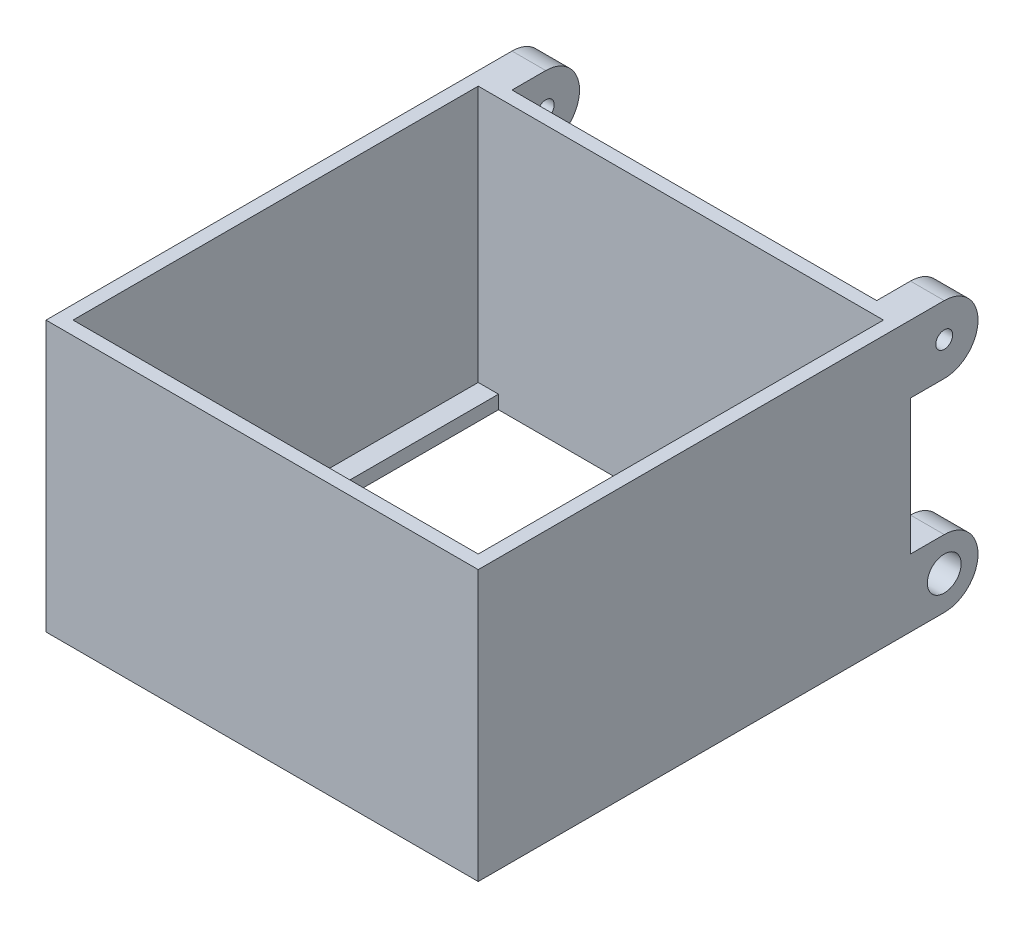
ISO-10303-21;
HEADER;
FILE_DESCRIPTION(('STEP AP214'),'2;1');
FILE_NAME('part.step','',(''),(''),'','','');
FILE_SCHEMA(('AUTOMOTIVE_DESIGN { 1 0 10303 214 1 1 1 1 }'));
ENDSEC;
DATA;
#1=APPLICATION_CONTEXT('core data for automotive mechanical design processes');
#2=APPLICATION_PROTOCOL_DEFINITION('international standard','automotive_design',2000,#1);
#3=PRODUCT_CONTEXT('',#1,'mechanical');
#4=PRODUCT('Part','Part','',(#3));
#5=PRODUCT_RELATED_PRODUCT_CATEGORY('part','',(#4));
#6=PRODUCT_DEFINITION_FORMATION('','',#4);
#7=PRODUCT_DEFINITION_CONTEXT('part definition',#1,'design');
#8=PRODUCT_DEFINITION('design','',#6,#7);
#9=PRODUCT_DEFINITION_SHAPE('','',#8);
#10=(LENGTH_UNIT() NAMED_UNIT(*) SI_UNIT(.MILLI.,.METRE.));
#11=(NAMED_UNIT(*) PLANE_ANGLE_UNIT() SI_UNIT($,.RADIAN.));
#12=(NAMED_UNIT(*) SI_UNIT($,.STERADIAN.) SOLID_ANGLE_UNIT());
#13=UNCERTAINTY_MEASURE_WITH_UNIT(LENGTH_MEASURE(1.E-05),#10,'distance_accuracy_value','');
#14=(GEOMETRIC_REPRESENTATION_CONTEXT(3) GLOBAL_UNCERTAINTY_ASSIGNED_CONTEXT((#13)) GLOBAL_UNIT_ASSIGNED_CONTEXT((#10,
#11,#12)) REPRESENTATION_CONTEXT('',''));
#15=CARTESIAN_POINT('',(0.,0.,0.));
#16=DIRECTION('',(0.,0.,1.));
#17=DIRECTION('',(1.,0.,0.));
#18=AXIS2_PLACEMENT_3D('',#15,#16,#17);
#19=CARTESIAN_POINT('',(-40.64,50.8,-40.64));
#20=DIRECTION('',(0.,0.,1.));
#21=DIRECTION('',(1.,0.,0.));
#22=AXIS2_PLACEMENT_3D('',#19,#20,#21);
#23=PLANE('',#22);
#24=DIRECTION('',(0.,-1.,0.));
#25=VECTOR('',#24,1.);
#26=CARTESIAN_POINT('',(-34.29,50.8,-40.64));
#27=LINE('',#26,#25);
#28=CARTESIAN_POINT('',(-34.29,50.8,-40.64));
#29=VERTEX_POINT('',#28);
#30=CARTESIAN_POINT('',(-34.29,38.1,-40.64));
#31=VERTEX_POINT('',#30);
#32=EDGE_CURVE('E216',#29,#31,#27,.T.);
#33=ORIENTED_EDGE('',*,*,#32,.F.);
#34=DIRECTION('',(-1.,0.,0.));
#35=VECTOR('',#34,1.);
#36=CARTESIAN_POINT('',(-40.64,50.8,-40.64));
#37=LINE('',#36,#35);
#38=CARTESIAN_POINT('',(34.29,50.8,-40.64));
#39=VERTEX_POINT('',#38);
#40=EDGE_CURVE('E471',#39,#29,#37,.T.);
#41=ORIENTED_EDGE('',*,*,#40,.F.);
#42=DIRECTION('',(0.,-1.,0.));
#43=VECTOR('',#42,1.);
#44=CARTESIAN_POINT('',(34.29,50.8,-40.64));
#45=LINE('',#44,#43);
#46=CARTESIAN_POINT('',(34.29,38.1,-40.64));
#47=VERTEX_POINT('',#46);
#48=EDGE_CURVE('E69',#39,#47,#45,.T.);
#49=ORIENTED_EDGE('',*,*,#48,.T.);
#50=DIRECTION('',(1.,0.,0.));
#51=VECTOR('',#50,1.);
#52=CARTESIAN_POINT('',(34.29,38.1,-40.64));
#53=LINE('',#52,#51);
#54=CARTESIAN_POINT('',(40.64,38.1,-40.64));
#55=VERTEX_POINT('',#54);
#56=EDGE_CURVE('E329',#47,#55,#53,.T.);
#57=ORIENTED_EDGE('',*,*,#56,.T.);
#58=DIRECTION('',(0.,-1.,0.));
#59=VECTOR('',#58,1.);
#60=CARTESIAN_POINT('',(40.64,50.8,-40.64));
#61=LINE('',#60,#59);
#62=CARTESIAN_POINT('',(40.64,12.7,-40.64));
#63=VERTEX_POINT('',#62);
#64=EDGE_CURVE('E490',#55,#63,#61,.T.);
#65=ORIENTED_EDGE('',*,*,#64,.T.);
#66=DIRECTION('',(1.,0.,0.));
#67=VECTOR('',#66,1.);
#68=CARTESIAN_POINT('',(34.29,12.7,-40.64));
#69=LINE('',#68,#67);
#70=CARTESIAN_POINT('',(34.29,12.7,-40.64));
#71=VERTEX_POINT('',#70);
#72=EDGE_CURVE('E372',#71,#63,#69,.T.);
#73=ORIENTED_EDGE('',*,*,#72,.F.);
#74=DIRECTION('',(0.,-1.,0.));
#75=VECTOR('',#74,1.);
#76=CARTESIAN_POINT('',(34.29,12.7,-40.64));
#77=LINE('',#76,#75);
#78=CARTESIAN_POINT('',(34.29,0.,-40.64));
#79=VERTEX_POINT('',#78);
#80=EDGE_CURVE('E352',#71,#79,#77,.T.);
#81=ORIENTED_EDGE('',*,*,#80,.T.);
#82=DIRECTION('',(-1.,0.,0.));
#83=VECTOR('',#82,1.);
#84=CARTESIAN_POINT('',(-40.64,0.,-40.64));
#85=LINE('',#84,#83);
#86=CARTESIAN_POINT('',(-34.29,0.,-40.64));
#87=VERTEX_POINT('',#86);
#88=EDGE_CURVE('E465',#79,#87,#85,.T.);
#89=ORIENTED_EDGE('',*,*,#88,.T.);
#90=DIRECTION('',(0.,-1.,0.));
#91=VECTOR('',#90,1.);
#92=CARTESIAN_POINT('',(-34.29,12.7,-40.64));
#93=LINE('',#92,#91);
#94=CARTESIAN_POINT('',(-34.29,12.7,-40.64));
#95=VERTEX_POINT('',#94);
#96=EDGE_CURVE('E270',#95,#87,#93,.T.);
#97=ORIENTED_EDGE('',*,*,#96,.F.);
#98=DIRECTION('',(-1.,0.,0.));
#99=VECTOR('',#98,1.);
#100=CARTESIAN_POINT('',(-34.29,12.7,-40.64));
#101=LINE('',#100,#99);
#102=CARTESIAN_POINT('',(-40.64,12.7,-40.64));
#103=VERTEX_POINT('',#102);
#104=EDGE_CURVE('E288',#95,#103,#101,.T.);
#105=ORIENTED_EDGE('',*,*,#104,.T.);
#106=DIRECTION('',(0.,-1.,0.));
#107=VECTOR('',#106,1.);
#108=CARTESIAN_POINT('',(-40.64,50.8,-40.64));
#109=LINE('',#108,#107);
#110=CARTESIAN_POINT('',(-40.64,38.1,-40.64));
#111=VERTEX_POINT('',#110);
#112=EDGE_CURVE('E475',#111,#103,#109,.T.);
#113=ORIENTED_EDGE('',*,*,#112,.F.);
#114=DIRECTION('',(-1.,0.,0.));
#115=VECTOR('',#114,1.);
#116=CARTESIAN_POINT('',(-34.29,38.1,-40.64));
#117=LINE('',#116,#115);
#118=EDGE_CURVE('E227',#31,#111,#117,.T.);
#119=ORIENTED_EDGE('',*,*,#118,.F.);
#120=EDGE_LOOP('',(#33,#41,#49,#57,#65,#73,#81,#89,#97,#105,#113,#119));
#121=FACE_BOUND('',#120,.T.);
#122=ADVANCED_FACE('F45',(#121),#23,.F.);
#123=CARTESIAN_POINT('',(-38.1,50.8,38.1));
#124=DIRECTION('',(0.,0.,-1.));
#125=DIRECTION('',(-1.,0.,0.));
#126=AXIS2_PLACEMENT_3D('',#123,#124,#125);
#127=PLANE('',#126);
#128=DIRECTION('',(1.,0.,0.));
#129=VECTOR('',#128,1.);
#130=CARTESIAN_POINT('',(-38.1,0.,38.1));
#131=LINE('',#130,#129);
#132=CARTESIAN_POINT('',(-34.29,0.,38.1));
#133=VERTEX_POINT('',#132);
#134=CARTESIAN_POINT('',(34.29,0.,38.1));
#135=VERTEX_POINT('',#134);
#136=EDGE_CURVE('E401',#133,#135,#131,.T.);
#137=ORIENTED_EDGE('',*,*,#136,.F.);
#138=DIRECTION('',(0.,-1.,0.));
#139=VECTOR('',#138,1.);
#140=CARTESIAN_POINT('',(-34.29,2.53999999999999,38.1));
#141=LINE('',#140,#139);
#142=CARTESIAN_POINT('',(-34.29,2.53999999999999,38.1));
#143=VERTEX_POINT('',#142);
#144=EDGE_CURVE('E398',#143,#133,#141,.T.);
#145=ORIENTED_EDGE('',*,*,#144,.F.);
#146=DIRECTION('',(1.,0.,0.));
#147=VECTOR('',#146,1.);
#148=CARTESIAN_POINT('',(-38.1,2.53999999999999,38.1));
#149=LINE('',#148,#147);
#150=CARTESIAN_POINT('',(-38.1,2.53999999999999,38.1));
#151=VERTEX_POINT('',#150);
#152=EDGE_CURVE('E381',#151,#143,#149,.T.);
#153=ORIENTED_EDGE('',*,*,#152,.F.);
#154=DIRECTION('',(0.,-1.,0.));
#155=VECTOR('',#154,1.);
#156=CARTESIAN_POINT('',(-38.1,50.8,38.1));
#157=LINE('',#156,#155);
#158=CARTESIAN_POINT('',(-38.1,50.8,38.1));
#159=VERTEX_POINT('',#158);
#160=EDGE_CURVE('E455',#159,#151,#157,.T.);
#161=ORIENTED_EDGE('',*,*,#160,.F.);
#162=DIRECTION('',(1.,0.,0.));
#163=VECTOR('',#162,1.);
#164=CARTESIAN_POINT('',(-38.1,50.8,38.1));
#165=LINE('',#164,#163);
#166=CARTESIAN_POINT('',(38.1,50.8,38.1));
#167=VERTEX_POINT('',#166);
#168=EDGE_CURVE('E426',#159,#167,#165,.T.);
#169=ORIENTED_EDGE('',*,*,#168,.T.);
#170=DIRECTION('',(0.,-1.,0.));
#171=VECTOR('',#170,1.);
#172=CARTESIAN_POINT('',(38.1,50.8,38.1));
#173=LINE('',#172,#171);
#174=CARTESIAN_POINT('',(38.1,2.53999999999999,38.1));
#175=VERTEX_POINT('',#174);
#176=EDGE_CURVE('E451',#167,#175,#173,.T.);
#177=ORIENTED_EDGE('',*,*,#176,.T.);
#178=DIRECTION('',(1.,0.,0.));
#179=VECTOR('',#178,1.);
#180=CARTESIAN_POINT('',(38.1,2.53999999999999,38.1));
#181=LINE('',#180,#179);
#182=CARTESIAN_POINT('',(34.29,2.53999999999999,38.1));
#183=VERTEX_POINT('',#182);
#184=EDGE_CURVE('E409',#183,#175,#181,.T.);
#185=ORIENTED_EDGE('',*,*,#184,.F.);
#186=DIRECTION('',(0.,-1.,0.));
#187=VECTOR('',#186,1.);
#188=CARTESIAN_POINT('',(34.29,2.53999999999999,38.1));
#189=LINE('',#188,#187);
#190=EDGE_CURVE('E405',#183,#135,#189,.T.);
#191=ORIENTED_EDGE('',*,*,#190,.T.);
#192=EDGE_LOOP('',(#137,#145,#153,#161,#169,#177,#185,#191));
#193=FACE_BOUND('',#192,.T.);
#194=ADVANCED_FACE('F540',(#193),#127,.T.);
#195=CARTESIAN_POINT('',(38.1,50.8,-38.1));
#196=DIRECTION('',(-1.,0.,0.));
#197=DIRECTION('',(0.,0.,1.));
#198=AXIS2_PLACEMENT_3D('',#195,#196,#197);
#199=PLANE('',#198);
#200=DIRECTION('',(0.,-1.,0.));
#201=VECTOR('',#200,1.);
#202=CARTESIAN_POINT('',(38.1,50.8,-38.1));
#203=LINE('',#202,#201);
#204=CARTESIAN_POINT('',(38.1,50.8,-38.1));
#205=VERTEX_POINT('',#204);
#206=CARTESIAN_POINT('',(38.1,2.53999999999999,-38.1));
#207=VERTEX_POINT('',#206);
#208=EDGE_CURVE('E447',#205,#207,#203,.T.);
#209=ORIENTED_EDGE('',*,*,#208,.T.);
#210=DIRECTION('',(0.,0.,-1.));
#211=VECTOR('',#210,1.);
#212=CARTESIAN_POINT('',(38.1,2.53999999999999,-38.1));
#213=LINE('',#212,#211);
#214=EDGE_CURVE('E412',#175,#207,#213,.T.);
#215=ORIENTED_EDGE('',*,*,#214,.F.);
#216=ORIENTED_EDGE('',*,*,#176,.F.);
#217=DIRECTION('',(0.,0.,-1.));
#218=VECTOR('',#217,1.);
#219=CARTESIAN_POINT('',(38.1,50.8,-38.1));
#220=LINE('',#219,#218);
#221=EDGE_CURVE('E430',#167,#205,#220,.T.);
#222=ORIENTED_EDGE('',*,*,#221,.T.);
#223=EDGE_LOOP('',(#209,#215,#216,#222));
#224=FACE_BOUND('',#223,.T.);
#225=ADVANCED_FACE('F546',(#224),#199,.T.);
#226=CARTESIAN_POINT('',(-38.1,50.8,-38.1));
#227=DIRECTION('',(0.,0.,1.));
#228=DIRECTION('',(1.,0.,0.));
#229=AXIS2_PLACEMENT_3D('',#226,#227,#228);
#230=PLANE('',#229);
#231=DIRECTION('',(-1.,0.,0.));
#232=VECTOR('',#231,1.);
#233=CARTESIAN_POINT('',(-38.1,2.53999999999999,-38.1));
#234=LINE('',#233,#232);
#235=CARTESIAN_POINT('',(-34.29,2.53999999999999,-38.1));
#236=VERTEX_POINT('',#235);
#237=CARTESIAN_POINT('',(-38.1,2.53999999999999,-38.1));
#238=VERTEX_POINT('',#237);
#239=EDGE_CURVE('E388',#236,#238,#234,.T.);
#240=ORIENTED_EDGE('',*,*,#239,.F.);
#241=DIRECTION('',(0.,-1.,0.));
#242=VECTOR('',#241,1.);
#243=CARTESIAN_POINT('',(-34.29,2.53999999999999,-38.1));
#244=LINE('',#243,#242);
#245=CARTESIAN_POINT('',(-34.29,0.,-38.1));
#246=VERTEX_POINT('',#245);
#247=EDGE_CURVE('E391',#236,#246,#244,.T.);
#248=ORIENTED_EDGE('',*,*,#247,.T.);
#249=DIRECTION('',(-1.,0.,0.));
#250=VECTOR('',#249,1.);
#251=CARTESIAN_POINT('',(-38.1,0.,-38.1));
#252=LINE('',#251,#250);
#253=CARTESIAN_POINT('',(34.29,0.,-38.1));
#254=VERTEX_POINT('',#253);
#255=EDGE_CURVE('E427',#254,#246,#252,.T.);
#256=ORIENTED_EDGE('',*,*,#255,.F.);
#257=DIRECTION('',(0.,-1.,0.));
#258=VECTOR('',#257,1.);
#259=CARTESIAN_POINT('',(34.29,2.53999999999999,-38.1));
#260=LINE('',#259,#258);
#261=CARTESIAN_POINT('',(34.29,2.53999999999999,-38.1));
#262=VERTEX_POINT('',#261);
#263=EDGE_CURVE('E371',#262,#254,#260,.T.);
#264=ORIENTED_EDGE('',*,*,#263,.F.);
#265=DIRECTION('',(-1.,0.,0.));
#266=VECTOR('',#265,1.);
#267=CARTESIAN_POINT('',(38.1,2.53999999999999,-38.1));
#268=LINE('',#267,#266);
#269=EDGE_CURVE('E418',#207,#262,#268,.T.);
#270=ORIENTED_EDGE('',*,*,#269,.F.);
#271=ORIENTED_EDGE('',*,*,#208,.F.);
#272=DIRECTION('',(-1.,0.,0.));
#273=VECTOR('',#272,1.);
#274=CARTESIAN_POINT('',(-38.1,50.8,-38.1));
#275=LINE('',#274,#273);
#276=CARTESIAN_POINT('',(-38.1,50.8,-38.1));
#277=VERTEX_POINT('',#276);
#278=EDGE_CURVE('E434',#205,#277,#275,.T.);
#279=ORIENTED_EDGE('',*,*,#278,.T.);
#280=DIRECTION('',(0.,-1.,0.));
#281=VECTOR('',#280,1.);
#282=CARTESIAN_POINT('',(-38.1,50.8,-38.1));
#283=LINE('',#282,#281);
#284=EDGE_CURVE('E437',#277,#238,#283,.T.);
#285=ORIENTED_EDGE('',*,*,#284,.T.);
#286=EDGE_LOOP('',(#240,#248,#256,#264,#270,#271,#279,#285));
#287=FACE_BOUND('',#286,.T.);
#288=ADVANCED_FACE('F644',(#287),#230,.T.);
#289=CARTESIAN_POINT('',(0.,50.8,0.));
#290=DIRECTION('',(0.,1.,0.));
#291=DIRECTION('',(0.,0.,1.));
#292=AXIS2_PLACEMENT_3D('',#289,#290,#291);
#293=PLANE('',#292);
#294=DIRECTION('',(0.,0.,1.));
#295=VECTOR('',#294,1.);
#296=CARTESIAN_POINT('',(-40.64,50.8,-40.64));
#297=LINE('',#296,#295);
#298=CARTESIAN_POINT('',(-40.64,50.8,-46.99));
#299=VERTEX_POINT('',#298);
#300=CARTESIAN_POINT('',(-40.64,50.8,40.64));
#301=VERTEX_POINT('',#300);
#302=EDGE_CURVE('E460',#299,#301,#297,.T.);
#303=ORIENTED_EDGE('',*,*,#302,.T.);
#304=DIRECTION('',(1.,0.,0.));
#305=VECTOR('',#304,1.);
#306=CARTESIAN_POINT('',(-40.64,50.8,40.64));
#307=LINE('',#306,#305);
#308=CARTESIAN_POINT('',(40.64,50.8,40.64));
#309=VERTEX_POINT('',#308);
#310=EDGE_CURVE('E464',#301,#309,#307,.T.);
#311=ORIENTED_EDGE('',*,*,#310,.T.);
#312=DIRECTION('',(0.,0.,-1.));
#313=VECTOR('',#312,1.);
#314=CARTESIAN_POINT('',(40.64,50.8,-40.64));
#315=LINE('',#314,#313);
#316=CARTESIAN_POINT('',(40.64,50.8,-46.99));
#317=VERTEX_POINT('',#316);
#318=EDGE_CURVE('E468',#309,#317,#315,.T.);
#319=ORIENTED_EDGE('',*,*,#318,.T.);
#320=DIRECTION('',(1.,0.,0.));
#321=VECTOR('',#320,1.);
#322=CARTESIAN_POINT('',(34.29,50.8,-46.99));
#323=LINE('',#322,#321);
#324=CARTESIAN_POINT('',(34.29,50.8,-46.99));
#325=VERTEX_POINT('',#324);
#326=EDGE_CURVE('E318',#325,#317,#323,.T.);
#327=ORIENTED_EDGE('',*,*,#326,.F.);
#328=DIRECTION('',(0.,0.,1.));
#329=VECTOR('',#328,1.);
#330=CARTESIAN_POINT('',(34.29,50.8,-46.99));
#331=LINE('',#330,#329);
#332=EDGE_CURVE('E307',#325,#39,#331,.T.);
#333=ORIENTED_EDGE('',*,*,#332,.T.);
#334=ORIENTED_EDGE('',*,*,#40,.T.);
#335=DIRECTION('',(0.,0.,1.));
#336=VECTOR('',#335,1.);
#337=CARTESIAN_POINT('',(-34.29,50.8,-46.99));
#338=LINE('',#337,#336);
#339=CARTESIAN_POINT('',(-34.29,50.8,-46.99));
#340=VERTEX_POINT('',#339);
#341=EDGE_CURVE('E228',#340,#29,#338,.T.);
#342=ORIENTED_EDGE('',*,*,#341,.F.);
#343=DIRECTION('',(-1.,0.,0.));
#344=VECTOR('',#343,1.);
#345=CARTESIAN_POINT('',(-34.29,50.8,-46.99));
#346=LINE('',#345,#344);
#347=EDGE_CURVE('E232',#340,#299,#346,.T.);
#348=ORIENTED_EDGE('',*,*,#347,.T.);
#349=EDGE_LOOP('',(#303,#311,#319,#327,#333,#334,#342,#348));
#350=FACE_BOUND('',#349,.T.);
#351=ORIENTED_EDGE('',*,*,#168,.F.);
#352=DIRECTION('',(0.,0.,1.));
#353=VECTOR('',#352,1.);
#354=CARTESIAN_POINT('',(-38.1,50.8,-38.1));
#355=LINE('',#354,#353);
#356=EDGE_CURVE('E423',#277,#159,#355,.T.);
#357=ORIENTED_EDGE('',*,*,#356,.F.);
#358=ORIENTED_EDGE('',*,*,#278,.F.);
#359=ORIENTED_EDGE('',*,*,#221,.F.);
#360=EDGE_LOOP('',(#351,#357,#358,#359));
#361=FACE_BOUND('',#360,.T.);
#362=ADVANCED_FACE('F523',(#350,#361),#293,.T.);
#363=CARTESIAN_POINT('',(0.,0.,0.));
#364=DIRECTION('',(0.,1.,0.));
#365=DIRECTION('',(0.,0.,1.));
#366=AXIS2_PLACEMENT_3D('',#363,#364,#365);
#367=PLANE('',#366);
#368=DIRECTION('',(0.,0.,-1.));
#369=VECTOR('',#368,1.);
#370=CARTESIAN_POINT('',(-34.29,0.,-38.1));
#371=LINE('',#370,#369);
#372=EDGE_CURVE('E382',#133,#246,#371,.T.);
#373=ORIENTED_EDGE('',*,*,#372,.F.);
#374=ORIENTED_EDGE('',*,*,#136,.T.);
#375=DIRECTION('',(0.,0.,1.));
#376=VECTOR('',#375,1.);
#377=CARTESIAN_POINT('',(34.29,0.,-38.1));
#378=LINE('',#377,#376);
#379=EDGE_CURVE('E394',#254,#135,#378,.T.);
#380=ORIENTED_EDGE('',*,*,#379,.F.);
#381=ORIENTED_EDGE('',*,*,#255,.T.);
#382=EDGE_LOOP('',(#373,#374,#380,#381));
#383=FACE_BOUND('',#382,.T.);
#384=DIRECTION('',(0.,0.,1.));
#385=VECTOR('',#384,1.);
#386=CARTESIAN_POINT('',(-40.64,0.,-40.64));
#387=LINE('',#386,#385);
#388=CARTESIAN_POINT('',(-40.64,0.,-46.99));
#389=VERTEX_POINT('',#388);
#390=CARTESIAN_POINT('',(-40.64,0.,40.64));
#391=VERTEX_POINT('',#390);
#392=EDGE_CURVE('E459',#389,#391,#387,.T.);
#393=ORIENTED_EDGE('',*,*,#392,.F.);
#394=DIRECTION('',(-1.,0.,0.));
#395=VECTOR('',#394,1.);
#396=CARTESIAN_POINT('',(-34.29,0.,-46.99));
#397=LINE('',#396,#395);
#398=CARTESIAN_POINT('',(-34.29,0.,-46.99));
#399=VERTEX_POINT('',#398);
#400=EDGE_CURVE('E276',#399,#389,#397,.T.);
#401=ORIENTED_EDGE('',*,*,#400,.F.);
#402=DIRECTION('',(0.,0.,-1.));
#403=VECTOR('',#402,1.);
#404=CARTESIAN_POINT('',(-34.29,0.,-46.99));
#405=LINE('',#404,#403);
#406=EDGE_CURVE('E266',#87,#399,#405,.T.);
#407=ORIENTED_EDGE('',*,*,#406,.F.);
#408=ORIENTED_EDGE('',*,*,#88,.F.);
#409=DIRECTION('',(0.,0.,-1.));
#410=VECTOR('',#409,1.);
#411=CARTESIAN_POINT('',(34.29,0.,-46.99));
#412=LINE('',#411,#410);
#413=CARTESIAN_POINT('',(34.29,0.,-46.99));
#414=VERTEX_POINT('',#413);
#415=EDGE_CURVE('E356',#79,#414,#412,.T.);
#416=ORIENTED_EDGE('',*,*,#415,.T.);
#417=DIRECTION('',(1.,0.,0.));
#418=VECTOR('',#417,1.);
#419=CARTESIAN_POINT('',(34.29,0.,-46.99));
#420=LINE('',#419,#418);
#421=CARTESIAN_POINT('',(40.64,0.,-46.99));
#422=VERTEX_POINT('',#421);
#423=EDGE_CURVE('E367',#414,#422,#420,.T.);
#424=ORIENTED_EDGE('',*,*,#423,.T.);
#425=DIRECTION('',(0.,0.,-1.));
#426=VECTOR('',#425,1.);
#427=CARTESIAN_POINT('',(40.64,0.,-40.64));
#428=LINE('',#427,#426);
#429=CARTESIAN_POINT('',(40.64,0.,40.64));
#430=VERTEX_POINT('',#429);
#431=EDGE_CURVE('E482',#430,#422,#428,.T.);
#432=ORIENTED_EDGE('',*,*,#431,.F.);
#433=DIRECTION('',(1.,0.,0.));
#434=VECTOR('',#433,1.);
#435=CARTESIAN_POINT('',(-40.64,0.,40.64));
#436=LINE('',#435,#434);
#437=EDGE_CURVE('E479',#391,#430,#436,.T.);
#438=ORIENTED_EDGE('',*,*,#437,.F.);
#439=EDGE_LOOP('',(#393,#401,#407,#408,#416,#424,#432,#438));
#440=FACE_BOUND('',#439,.T.);
#441=ADVANCED_FACE('F502',(#383,#440),#367,.F.);
#442=CARTESIAN_POINT('',(-40.64,50.8,-40.64));
#443=DIRECTION('',(1.,0.,0.));
#444=DIRECTION('',(0.,0.,-1.));
#445=AXIS2_PLACEMENT_3D('',#442,#443,#444);
#446=PLANE('',#445);
#447=ORIENTED_EDGE('',*,*,#392,.T.);
#448=DIRECTION('',(0.,-1.,0.));
#449=VECTOR('',#448,1.);
#450=CARTESIAN_POINT('',(-40.64,50.8,40.64));
#451=LINE('',#450,#449);
#452=EDGE_CURVE('E11',#301,#391,#451,.T.);
#453=ORIENTED_EDGE('',*,*,#452,.F.);
#454=ORIENTED_EDGE('',*,*,#302,.F.);
#455=CARTESIAN_POINT('',(-40.64,44.45,-46.99));
#456=DIRECTION('',(1.,0.,0.));
#457=DIRECTION('',(0.,0.,-1.));
#458=AXIS2_PLACEMENT_3D('',#455,#456,#457);
#459=CIRCLE('',#458,6.35);
#460=CARTESIAN_POINT('',(-40.64,38.1,-46.99));
#461=VERTEX_POINT('',#460);
#462=EDGE_CURVE('E236',#461,#299,#459,.T.);
#463=ORIENTED_EDGE('',*,*,#462,.F.);
#464=DIRECTION('',(0.,0.,-1.));
#465=VECTOR('',#464,1.);
#466=CARTESIAN_POINT('',(-40.64,38.1,-46.99));
#467=LINE('',#466,#465);
#468=EDGE_CURVE('E61',#111,#461,#467,.T.);
#469=ORIENTED_EDGE('',*,*,#468,.F.);
#470=ORIENTED_EDGE('',*,*,#112,.T.);
#471=DIRECTION('',(0.,0.,1.));
#472=VECTOR('',#471,1.);
#473=CARTESIAN_POINT('',(-40.64,12.7,-46.99));
#474=LINE('',#473,#472);
#475=CARTESIAN_POINT('',(-40.64,12.7,-46.99));
#476=VERTEX_POINT('',#475);
#477=EDGE_CURVE('E267',#476,#103,#474,.T.);
#478=ORIENTED_EDGE('',*,*,#477,.F.);
#479=CARTESIAN_POINT('',(-40.64,6.35,-46.99));
#480=DIRECTION('',(1.,0.,0.));
#481=DIRECTION('',(0.,0.,-1.));
#482=AXIS2_PLACEMENT_3D('',#479,#480,#481);
#483=CIRCLE('',#482,6.35);
#484=EDGE_CURVE('E258',#389,#476,#483,.T.);
#485=ORIENTED_EDGE('',*,*,#484,.F.);
#486=EDGE_LOOP('',(#447,#453,#454,#463,#469,#470,#478,#485));
#487=FACE_BOUND('',#486,.T.);
#488=CARTESIAN_POINT('',(-40.64,6.35,-46.99));
#489=DIRECTION('',(1.,0.,0.));
#490=DIRECTION('',(0.,0.,-1.));
#491=AXIS2_PLACEMENT_3D('',#488,#489,#490);
#492=CIRCLE('',#491,3.175);
#493=CARTESIAN_POINT('',(-40.64,6.35,-50.165));
#494=VERTEX_POINT('',#493);
#495=EDGE_CURVE('E251',#494,#494,#492,.T.);
#496=ORIENTED_EDGE('',*,*,#495,.T.);
#497=EDGE_LOOP('',(#496));
#498=FACE_BOUND('',#497,.T.);
#499=CARTESIAN_POINT('',(-40.64,44.45,-46.99));
#500=DIRECTION('',(1.,0.,0.));
#501=DIRECTION('',(0.,0.,-1.));
#502=AXIS2_PLACEMENT_3D('',#499,#500,#501);
#503=CIRCLE('',#502,1.5875);
#504=CARTESIAN_POINT('',(-40.64,44.45,-48.5775));
#505=VERTEX_POINT('',#504);
#506=EDGE_CURVE('E239',#505,#505,#503,.T.);
#507=ORIENTED_EDGE('',*,*,#506,.T.);
#508=EDGE_LOOP('',(#507));
#509=FACE_BOUND('',#508,.T.);
#510=ADVANCED_FACE('F47',(#487,#498,#509),#446,.F.);
#511=CARTESIAN_POINT('',(-40.64,50.8,40.64));
#512=DIRECTION('',(0.,0.,-1.));
#513=DIRECTION('',(-1.,0.,0.));
#514=AXIS2_PLACEMENT_3D('',#511,#512,#513);
#515=PLANE('',#514);
#516=ORIENTED_EDGE('',*,*,#437,.T.);
#517=DIRECTION('',(0.,-1.,0.));
#518=VECTOR('',#517,1.);
#519=CARTESIAN_POINT('',(40.64,50.8,40.64));
#520=LINE('',#519,#518);
#521=EDGE_CURVE('E54',#309,#430,#520,.T.);
#522=ORIENTED_EDGE('',*,*,#521,.F.);
#523=ORIENTED_EDGE('',*,*,#310,.F.);
#524=ORIENTED_EDGE('',*,*,#452,.T.);
#525=EDGE_LOOP('',(#516,#522,#523,#524));
#526=FACE_BOUND('',#525,.T.);
#527=ADVANCED_FACE('F554',(#526),#515,.F.);
#528=CARTESIAN_POINT('',(40.64,50.8,-40.64));
#529=DIRECTION('',(-1.,0.,0.));
#530=DIRECTION('',(0.,0.,1.));
#531=AXIS2_PLACEMENT_3D('',#528,#529,#530);
#532=PLANE('',#531);
#533=ORIENTED_EDGE('',*,*,#431,.T.);
#534=CARTESIAN_POINT('',(40.64,6.35,-46.99));
#535=DIRECTION('',(1.,0.,0.));
#536=DIRECTION('',(0.,0.,-1.));
#537=AXIS2_PLACEMENT_3D('',#534,#535,#536);
#538=CIRCLE('',#537,6.35);
#539=CARTESIAN_POINT('',(40.64,12.7,-46.99));
#540=VERTEX_POINT('',#539);
#541=EDGE_CURVE('E339',#422,#540,#538,.T.);
#542=ORIENTED_EDGE('',*,*,#541,.T.);
#543=DIRECTION('',(0.,0.,1.));
#544=VECTOR('',#543,1.);
#545=CARTESIAN_POINT('',(40.64,12.7,-46.99));
#546=LINE('',#545,#544);
#547=EDGE_CURVE('E348',#540,#63,#546,.T.);
#548=ORIENTED_EDGE('',*,*,#547,.T.);
#549=ORIENTED_EDGE('',*,*,#64,.F.);
#550=DIRECTION('',(0.,0.,-1.));
#551=VECTOR('',#550,1.);
#552=CARTESIAN_POINT('',(40.64,38.1,-46.99));
#553=LINE('',#552,#551);
#554=CARTESIAN_POINT('',(40.64,38.1,-46.99));
#555=VERTEX_POINT('',#554);
#556=EDGE_CURVE('E308',#55,#555,#553,.T.);
#557=ORIENTED_EDGE('',*,*,#556,.T.);
#558=CARTESIAN_POINT('',(40.64,44.45,-46.99));
#559=DIRECTION('',(1.,0.,0.));
#560=DIRECTION('',(0.,0.,-1.));
#561=AXIS2_PLACEMENT_3D('',#558,#559,#560);
#562=CIRCLE('',#561,6.35);
#563=EDGE_CURVE('E299',#555,#317,#562,.T.);
#564=ORIENTED_EDGE('',*,*,#563,.T.);
#565=ORIENTED_EDGE('',*,*,#318,.F.);
#566=ORIENTED_EDGE('',*,*,#521,.T.);
#567=EDGE_LOOP('',(#533,#542,#548,#549,#557,#564,#565,#566));
#568=FACE_BOUND('',#567,.T.);
#569=CARTESIAN_POINT('',(40.64,6.35,-46.99));
#570=DIRECTION('',(1.,0.,0.));
#571=DIRECTION('',(0.,0.,-1.));
#572=AXIS2_PLACEMENT_3D('',#569,#570,#571);
#573=CIRCLE('',#572,3.175);
#574=CARTESIAN_POINT('',(40.64,6.35,-50.165));
#575=VERTEX_POINT('',#574);
#576=EDGE_CURVE('E328',#575,#575,#573,.T.);
#577=ORIENTED_EDGE('',*,*,#576,.F.);
#578=EDGE_LOOP('',(#577));
#579=FACE_BOUND('',#578,.T.);
#580=CARTESIAN_POINT('',(40.64,44.45,-46.99));
#581=DIRECTION('',(1.,0.,0.));
#582=DIRECTION('',(0.,0.,-1.));
#583=AXIS2_PLACEMENT_3D('',#580,#581,#582);
#584=CIRCLE('',#583,1.5875);
#585=CARTESIAN_POINT('',(40.64,44.45,-48.5775));
#586=VERTEX_POINT('',#585);
#587=EDGE_CURVE('E287',#586,#586,#584,.T.);
#588=ORIENTED_EDGE('',*,*,#587,.F.);
#589=EDGE_LOOP('',(#588));
#590=FACE_BOUND('',#589,.T.);
#591=ADVANCED_FACE('F498',(#568,#579,#590),#532,.F.);
#592=CARTESIAN_POINT('',(-38.1,50.8,-38.1));
#593=DIRECTION('',(1.,0.,0.));
#594=DIRECTION('',(0.,0.,-1.));
#595=AXIS2_PLACEMENT_3D('',#592,#593,#594);
#596=PLANE('',#595);
#597=DIRECTION('',(0.,0.,1.));
#598=VECTOR('',#597,1.);
#599=CARTESIAN_POINT('',(-38.1,2.53999999999999,-38.1));
#600=LINE('',#599,#598);
#601=EDGE_CURVE('E378',#238,#151,#600,.T.);
#602=ORIENTED_EDGE('',*,*,#601,.F.);
#603=ORIENTED_EDGE('',*,*,#284,.F.);
#604=ORIENTED_EDGE('',*,*,#356,.T.);
#605=ORIENTED_EDGE('',*,*,#160,.T.);
#606=EDGE_LOOP('',(#602,#603,#604,#605));
#607=FACE_BOUND('',#606,.T.);
#608=ADVANCED_FACE('F553',(#607),#596,.T.);
#609=CARTESIAN_POINT('',(34.29,2.53999999999999,-38.1));
#610=DIRECTION('',(1.,0.,0.));
#611=DIRECTION('',(0.,0.,-1.));
#612=AXIS2_PLACEMENT_3D('',#609,#610,#611);
#613=PLANE('',#612);
#614=ORIENTED_EDGE('',*,*,#379,.T.);
#615=ORIENTED_EDGE('',*,*,#190,.F.);
#616=DIRECTION('',(0.,0.,1.));
#617=VECTOR('',#616,1.);
#618=CARTESIAN_POINT('',(34.29,2.53999999999999,-38.1));
#619=LINE('',#618,#617);
#620=EDGE_CURVE('E415',#262,#183,#619,.T.);
#621=ORIENTED_EDGE('',*,*,#620,.F.);
#622=ORIENTED_EDGE('',*,*,#263,.T.);
#623=EDGE_LOOP('',(#614,#615,#621,#622));
#624=FACE_BOUND('',#623,.T.);
#625=ADVANCED_FACE('F751',(#624),#613,.F.);
#626=CARTESIAN_POINT('',(0.,2.53999999999999,0.));
#627=DIRECTION('',(0.,-1.,0.));
#628=DIRECTION('',(0.,0.,-1.));
#629=AXIS2_PLACEMENT_3D('',#626,#627,#628);
#630=PLANE('',#629);
#631=ORIENTED_EDGE('',*,*,#214,.T.);
#632=ORIENTED_EDGE('',*,*,#269,.T.);
#633=ORIENTED_EDGE('',*,*,#620,.T.);
#634=ORIENTED_EDGE('',*,*,#184,.T.);
#635=EDGE_LOOP('',(#631,#632,#633,#634));
#636=FACE_BOUND('',#635,.T.);
#637=ADVANCED_FACE('F742',(#636),#630,.F.);
#638=CARTESIAN_POINT('',(-34.29,2.53999999999999,-38.1));
#639=DIRECTION('',(-1.,0.,0.));
#640=DIRECTION('',(0.,0.,1.));
#641=AXIS2_PLACEMENT_3D('',#638,#639,#640);
#642=PLANE('',#641);
#643=ORIENTED_EDGE('',*,*,#372,.T.);
#644=ORIENTED_EDGE('',*,*,#247,.F.);
#645=DIRECTION('',(0.,0.,-1.));
#646=VECTOR('',#645,1.);
#647=CARTESIAN_POINT('',(-34.29,2.53999999999999,-38.1));
#648=LINE('',#647,#646);
#649=EDGE_CURVE('E385',#143,#236,#648,.T.);
#650=ORIENTED_EDGE('',*,*,#649,.F.);
#651=ORIENTED_EDGE('',*,*,#144,.T.);
#652=EDGE_LOOP('',(#643,#644,#650,#651));
#653=FACE_BOUND('',#652,.T.);
#654=ADVANCED_FACE('F732',(#653),#642,.F.);
#655=CARTESIAN_POINT('',(0.,2.53999999999999,0.));
#656=DIRECTION('',(0.,1.,0.));
#657=DIRECTION('',(0.,0.,1.));
#658=AXIS2_PLACEMENT_3D('',#655,#656,#657);
#659=PLANE('',#658);
#660=ORIENTED_EDGE('',*,*,#601,.T.);
#661=ORIENTED_EDGE('',*,*,#152,.T.);
#662=ORIENTED_EDGE('',*,*,#649,.T.);
#663=ORIENTED_EDGE('',*,*,#239,.T.);
#664=EDGE_LOOP('',(#660,#661,#662,#663));
#665=FACE_BOUND('',#664,.T.);
#666=ADVANCED_FACE('F723',(#665),#659,.T.);
#667=CARTESIAN_POINT('',(34.29,6.35,-46.99));
#668=DIRECTION('',(1.,0.,0.));
#669=DIRECTION('',(0.,0.,-1.));
#670=AXIS2_PLACEMENT_3D('',#667,#668,#669);
#671=CYLINDRICAL_SURFACE('',#670,6.35);
#672=ORIENTED_EDGE('',*,*,#541,.F.);
#673=ORIENTED_EDGE('',*,*,#423,.F.);
#674=CARTESIAN_POINT('',(34.29,6.35,-46.99));
#675=DIRECTION('',(1.,0.,0.));
#676=DIRECTION('',(0.,0.,-1.));
#677=AXIS2_PLACEMENT_3D('',#674,#675,#676);
#678=CIRCLE('',#677,6.35);
#679=CARTESIAN_POINT('',(34.29,12.7,-46.99));
#680=VERTEX_POINT('',#679);
#681=EDGE_CURVE('E343',#414,#680,#678,.T.);
#682=ORIENTED_EDGE('',*,*,#681,.T.);
#683=DIRECTION('',(1.,0.,0.));
#684=VECTOR('',#683,1.);
#685=CARTESIAN_POINT('',(34.29,12.7,-46.99));
#686=LINE('',#685,#684);
#687=EDGE_CURVE('E360',#680,#540,#686,.T.);
#688=ORIENTED_EDGE('',*,*,#687,.T.);
#689=EDGE_LOOP('',(#672,#673,#682,#688));
#690=FACE_BOUND('',#689,.T.);
#691=ADVANCED_FACE('F507',(#690),#671,.T.);
#692=CARTESIAN_POINT('',(34.29,12.7,-46.99));
#693=DIRECTION('',(0.,1.,0.));
#694=DIRECTION('',(0.,0.,1.));
#695=AXIS2_PLACEMENT_3D('',#692,#693,#694);
#696=PLANE('',#695);
#697=ORIENTED_EDGE('',*,*,#547,.F.);
#698=ORIENTED_EDGE('',*,*,#687,.F.);
#699=DIRECTION('',(0.,0.,1.));
#700=VECTOR('',#699,1.);
#701=CARTESIAN_POINT('',(34.29,12.7,-46.99));
#702=LINE('',#701,#700);
#703=EDGE_CURVE('E347',#680,#71,#702,.T.);
#704=ORIENTED_EDGE('',*,*,#703,.T.);
#705=ORIENTED_EDGE('',*,*,#72,.T.);
#706=EDGE_LOOP('',(#697,#698,#704,#705));
#707=FACE_BOUND('',#706,.T.);
#708=ADVANCED_FACE('F510',(#707),#696,.T.);
#709=CARTESIAN_POINT('',(34.29,6.35,-46.99));
#710=DIRECTION('',(1.,0.,0.));
#711=DIRECTION('',(0.,0.,-1.));
#712=AXIS2_PLACEMENT_3D('',#709,#710,#711);
#713=PLANE('',#712);
#714=CARTESIAN_POINT('',(34.29,6.35,-46.99));
#715=DIRECTION('',(1.,0.,0.));
#716=DIRECTION('',(0.,0.,-1.));
#717=AXIS2_PLACEMENT_3D('',#714,#715,#716);
#718=CIRCLE('',#717,3.175);
#719=CARTESIAN_POINT('',(34.29,6.35,-50.165));
#720=VERTEX_POINT('',#719);
#721=EDGE_CURVE('E335',#720,#720,#718,.T.);
#722=ORIENTED_EDGE('',*,*,#721,.T.);
#723=EDGE_LOOP('',(#722));
#724=FACE_BOUND('',#723,.T.);
#725=ORIENTED_EDGE('',*,*,#681,.F.);
#726=ORIENTED_EDGE('',*,*,#415,.F.);
#727=ORIENTED_EDGE('',*,*,#80,.F.);
#728=ORIENTED_EDGE('',*,*,#703,.F.);
#729=EDGE_LOOP('',(#725,#726,#727,#728));
#730=FACE_BOUND('',#729,.T.);
#731=ADVANCED_FACE('F699',(#724,#730),#713,.F.);
#732=CARTESIAN_POINT('',(34.29,6.35,-46.99));
#733=DIRECTION('',(1.,0.,0.));
#734=DIRECTION('',(0.,0.,-1.));
#735=AXIS2_PLACEMENT_3D('',#732,#733,#734);
#736=CYLINDRICAL_SURFACE('',#735,3.175);
#737=ORIENTED_EDGE('',*,*,#721,.F.);
#738=EDGE_LOOP('',(#737));
#739=FACE_BOUND('',#738,.T.);
#740=ORIENTED_EDGE('',*,*,#576,.T.);
#741=EDGE_LOOP('',(#740));
#742=FACE_BOUND('',#741,.T.);
#743=ADVANCED_FACE('F692',(#739,#742),#736,.F.);
#744=CARTESIAN_POINT('',(34.29,44.45,-46.99));
#745=DIRECTION('',(1.,0.,0.));
#746=DIRECTION('',(0.,0.,-1.));
#747=AXIS2_PLACEMENT_3D('',#744,#745,#746);
#748=CYLINDRICAL_SURFACE('',#747,6.35);
#749=ORIENTED_EDGE('',*,*,#563,.F.);
#750=DIRECTION('',(1.,0.,0.));
#751=VECTOR('',#750,1.);
#752=CARTESIAN_POINT('',(34.29,38.1,-46.99));
#753=LINE('',#752,#751);
#754=CARTESIAN_POINT('',(34.29,38.1,-46.99));
#755=VERTEX_POINT('',#754);
#756=EDGE_CURVE('E325',#755,#555,#753,.T.);
#757=ORIENTED_EDGE('',*,*,#756,.F.);
#758=CARTESIAN_POINT('',(34.29,44.45,-46.99));
#759=DIRECTION('',(1.,0.,0.));
#760=DIRECTION('',(0.,0.,-1.));
#761=AXIS2_PLACEMENT_3D('',#758,#759,#760);
#762=CIRCLE('',#761,6.35);
#763=EDGE_CURVE('E303',#755,#325,#762,.T.);
#764=ORIENTED_EDGE('',*,*,#763,.T.);
#765=ORIENTED_EDGE('',*,*,#326,.T.);
#766=EDGE_LOOP('',(#749,#757,#764,#765));
#767=FACE_BOUND('',#766,.T.);
#768=ADVANCED_FACE('F519',(#767),#748,.T.);
#769=CARTESIAN_POINT('',(34.29,38.1,-46.99));
#770=DIRECTION('',(0.,-1.,0.));
#771=DIRECTION('',(0.,0.,-1.));
#772=AXIS2_PLACEMENT_3D('',#769,#770,#771);
#773=PLANE('',#772);
#774=ORIENTED_EDGE('',*,*,#556,.F.);
#775=ORIENTED_EDGE('',*,*,#56,.F.);
#776=DIRECTION('',(0.,0.,-1.));
#777=VECTOR('',#776,1.);
#778=CARTESIAN_POINT('',(34.29,38.1,-46.99));
#779=LINE('',#778,#777);
#780=EDGE_CURVE('E314',#47,#755,#779,.T.);
#781=ORIENTED_EDGE('',*,*,#780,.T.);
#782=ORIENTED_EDGE('',*,*,#756,.T.);
#783=EDGE_LOOP('',(#774,#775,#781,#782));
#784=FACE_BOUND('',#783,.T.);
#785=ADVANCED_FACE('F516',(#784),#773,.T.);
#786=CARTESIAN_POINT('',(34.29,44.45,-46.99));
#787=DIRECTION('',(1.,0.,0.));
#788=DIRECTION('',(0.,0.,-1.));
#789=AXIS2_PLACEMENT_3D('',#786,#787,#788);
#790=PLANE('',#789);
#791=CARTESIAN_POINT('',(34.29,44.45,-46.99));
#792=DIRECTION('',(1.,0.,0.));
#793=DIRECTION('',(0.,0.,-1.));
#794=AXIS2_PLACEMENT_3D('',#791,#792,#793);
#795=CIRCLE('',#794,1.5875);
#796=CARTESIAN_POINT('',(34.29,44.45,-48.5775));
#797=VERTEX_POINT('',#796);
#798=EDGE_CURVE('E295',#797,#797,#795,.T.);
#799=ORIENTED_EDGE('',*,*,#798,.T.);
#800=EDGE_LOOP('',(#799));
#801=FACE_BOUND('',#800,.T.);
#802=ORIENTED_EDGE('',*,*,#763,.F.);
#803=ORIENTED_EDGE('',*,*,#780,.F.);
#804=ORIENTED_EDGE('',*,*,#48,.F.);
#805=ORIENTED_EDGE('',*,*,#332,.F.);
#806=EDGE_LOOP('',(#802,#803,#804,#805));
#807=FACE_BOUND('',#806,.T.);
#808=ADVANCED_FACE('F526',(#801,#807),#790,.F.);
#809=CARTESIAN_POINT('',(34.29,44.45,-46.99));
#810=DIRECTION('',(1.,0.,0.));
#811=DIRECTION('',(0.,0.,-1.));
#812=AXIS2_PLACEMENT_3D('',#809,#810,#811);
#813=CYLINDRICAL_SURFACE('',#812,1.5875);
#814=ORIENTED_EDGE('',*,*,#798,.F.);
#815=EDGE_LOOP('',(#814));
#816=FACE_BOUND('',#815,.T.);
#817=ORIENTED_EDGE('',*,*,#587,.T.);
#818=EDGE_LOOP('',(#817));
#819=FACE_BOUND('',#818,.T.);
#820=ADVANCED_FACE('F528',(#816,#819),#813,.F.);
#821=CARTESIAN_POINT('',(-34.29,6.35,-46.99));
#822=DIRECTION('',(-1.,0.,0.));
#823=DIRECTION('',(0.,0.,-1.));
#824=AXIS2_PLACEMENT_3D('',#821,#822,#823);
#825=PLANE('',#824);
#826=CARTESIAN_POINT('',(-34.29,6.35,-46.99));
#827=DIRECTION('',(1.,0.,0.));
#828=DIRECTION('',(0.,0.,-1.));
#829=AXIS2_PLACEMENT_3D('',#826,#827,#828);
#830=CIRCLE('',#829,6.35);
#831=CARTESIAN_POINT('',(-34.29,12.7,-46.99));
#832=VERTEX_POINT('',#831);
#833=EDGE_CURVE('E262',#399,#832,#830,.T.);
#834=ORIENTED_EDGE('',*,*,#833,.T.);
#835=DIRECTION('',(0.,0.,1.));
#836=VECTOR('',#835,1.);
#837=CARTESIAN_POINT('',(-34.29,12.7,-46.99));
#838=LINE('',#837,#836);
#839=EDGE_CURVE('E273',#832,#95,#838,.T.);
#840=ORIENTED_EDGE('',*,*,#839,.T.);
#841=ORIENTED_EDGE('',*,*,#96,.T.);
#842=ORIENTED_EDGE('',*,*,#406,.T.);
#843=EDGE_LOOP('',(#834,#840,#841,#842));
#844=FACE_BOUND('',#843,.T.);
#845=CARTESIAN_POINT('',(-34.29,6.35,-46.99));
#846=DIRECTION('',(1.,0.,0.));
#847=DIRECTION('',(0.,0.,-1.));
#848=AXIS2_PLACEMENT_3D('',#845,#846,#847);
#849=CIRCLE('',#848,3.175);
#850=CARTESIAN_POINT('',(-34.29,6.35,-50.165));
#851=VERTEX_POINT('',#850);
#852=EDGE_CURVE('E254',#851,#851,#849,.T.);
#853=ORIENTED_EDGE('',*,*,#852,.F.);
#854=EDGE_LOOP('',(#853));
#855=FACE_BOUND('',#854,.T.);
#856=ADVANCED_FACE('F535',(#844,#855),#825,.F.);
#857=CARTESIAN_POINT('',(-34.29,6.35,-46.99));
#858=DIRECTION('',(-1.,0.,0.));
#859=DIRECTION('',(0.,0.,1.));
#860=AXIS2_PLACEMENT_3D('',#857,#858,#859);
#861=CYLINDRICAL_SURFACE('',#860,6.35);
#862=ORIENTED_EDGE('',*,*,#484,.T.);
#863=DIRECTION('',(-1.,0.,0.));
#864=VECTOR('',#863,1.);
#865=CARTESIAN_POINT('',(-34.29,12.7,-46.99));
#866=LINE('',#865,#864);
#867=EDGE_CURVE('E283',#832,#476,#866,.T.);
#868=ORIENTED_EDGE('',*,*,#867,.F.);
#869=ORIENTED_EDGE('',*,*,#833,.F.);
#870=ORIENTED_EDGE('',*,*,#400,.T.);
#871=EDGE_LOOP('',(#862,#868,#869,#870));
#872=FACE_BOUND('',#871,.T.);
#873=ADVANCED_FACE('F566',(#872),#861,.T.);
#874=CARTESIAN_POINT('',(-34.29,12.7,-46.99));
#875=DIRECTION('',(0.,-1.,0.));
#876=DIRECTION('',(0.,0.,-1.));
#877=AXIS2_PLACEMENT_3D('',#874,#875,#876);
#878=PLANE('',#877);
#879=ORIENTED_EDGE('',*,*,#477,.T.);
#880=ORIENTED_EDGE('',*,*,#104,.F.);
#881=ORIENTED_EDGE('',*,*,#839,.F.);
#882=ORIENTED_EDGE('',*,*,#867,.T.);
#883=EDGE_LOOP('',(#879,#880,#881,#882));
#884=FACE_BOUND('',#883,.T.);
#885=ADVANCED_FACE('F574',(#884),#878,.F.);
#886=CARTESIAN_POINT('',(-34.29,6.35,-46.99));
#887=DIRECTION('',(-1.,0.,0.));
#888=DIRECTION('',(0.,0.,1.));
#889=AXIS2_PLACEMENT_3D('',#886,#887,#888);
#890=CYLINDRICAL_SURFACE('',#889,3.175);
#891=ORIENTED_EDGE('',*,*,#852,.T.);
#892=EDGE_LOOP('',(#891));
#893=FACE_BOUND('',#892,.T.);
#894=ORIENTED_EDGE('',*,*,#495,.F.);
#895=EDGE_LOOP('',(#894));
#896=FACE_BOUND('',#895,.T.);
#897=ADVANCED_FACE('F576',(#893,#896),#890,.F.);
#898=CARTESIAN_POINT('',(-34.29,44.45,-46.99));
#899=DIRECTION('',(-1.,0.,0.));
#900=DIRECTION('',(0.,0.,-1.));
#901=AXIS2_PLACEMENT_3D('',#898,#899,#900);
#902=PLANE('',#901);
#903=CARTESIAN_POINT('',(-34.29,44.45,-46.99));
#904=DIRECTION('',(1.,0.,0.));
#905=DIRECTION('',(0.,0.,-1.));
#906=AXIS2_PLACEMENT_3D('',#903,#904,#905);
#907=CIRCLE('',#906,6.35);
#908=CARTESIAN_POINT('',(-34.29,38.1,-46.99));
#909=VERTEX_POINT('',#908);
#910=EDGE_CURVE('E213',#909,#340,#907,.T.);
#911=ORIENTED_EDGE('',*,*,#910,.T.);
#912=ORIENTED_EDGE('',*,*,#341,.T.);
#913=ORIENTED_EDGE('',*,*,#32,.T.);
#914=DIRECTION('',(0.,0.,-1.));
#915=VECTOR('',#914,1.);
#916=CARTESIAN_POINT('',(-34.29,38.1,-46.99));
#917=LINE('',#916,#915);
#918=EDGE_CURVE('E208',#31,#909,#917,.T.);
#919=ORIENTED_EDGE('',*,*,#918,.T.);
#920=EDGE_LOOP('',(#911,#912,#913,#919));
#921=FACE_BOUND('',#920,.T.);
#922=CARTESIAN_POINT('',(-34.29,44.45,-46.99));
#923=DIRECTION('',(1.,0.,0.));
#924=DIRECTION('',(0.,0.,-1.));
#925=AXIS2_PLACEMENT_3D('',#922,#923,#924);
#926=CIRCLE('',#925,1.5875);
#927=CARTESIAN_POINT('',(-34.29,44.45,-48.5775));
#928=VERTEX_POINT('',#927);
#929=EDGE_CURVE('E247',#928,#928,#926,.T.);
#930=ORIENTED_EDGE('',*,*,#929,.F.);
#931=EDGE_LOOP('',(#930));
#932=FACE_BOUND('',#931,.T.);
#933=ADVANCED_FACE('F210',(#921,#932),#902,.F.);
#934=CARTESIAN_POINT('',(-34.29,44.45,-46.99));
#935=DIRECTION('',(-1.,0.,0.));
#936=DIRECTION('',(0.,0.,1.));
#937=AXIS2_PLACEMENT_3D('',#934,#935,#936);
#938=CYLINDRICAL_SURFACE('',#937,6.35);
#939=ORIENTED_EDGE('',*,*,#462,.T.);
#940=ORIENTED_EDGE('',*,*,#347,.F.);
#941=ORIENTED_EDGE('',*,*,#910,.F.);
#942=DIRECTION('',(-1.,0.,0.));
#943=VECTOR('',#942,1.);
#944=CARTESIAN_POINT('',(-34.29,38.1,-46.99));
#945=LINE('',#944,#943);
#946=EDGE_CURVE('E222',#909,#461,#945,.T.);
#947=ORIENTED_EDGE('',*,*,#946,.T.);
#948=EDGE_LOOP('',(#939,#940,#941,#947));
#949=FACE_BOUND('',#948,.T.);
#950=ADVANCED_FACE('F230',(#949),#938,.T.);
#951=CARTESIAN_POINT('',(-34.29,38.1,-46.99));
#952=DIRECTION('',(0.,1.,0.));
#953=DIRECTION('',(0.,0.,1.));
#954=AXIS2_PLACEMENT_3D('',#951,#952,#953);
#955=PLANE('',#954);
#956=ORIENTED_EDGE('',*,*,#468,.T.);
#957=ORIENTED_EDGE('',*,*,#946,.F.);
#958=ORIENTED_EDGE('',*,*,#918,.F.);
#959=ORIENTED_EDGE('',*,*,#118,.T.);
#960=EDGE_LOOP('',(#956,#957,#958,#959));
#961=FACE_BOUND('',#960,.T.);
#962=ADVANCED_FACE('F223',(#961),#955,.F.);
#963=CARTESIAN_POINT('',(-34.29,44.45,-46.99));
#964=DIRECTION('',(-1.,0.,0.));
#965=DIRECTION('',(0.,0.,1.));
#966=AXIS2_PLACEMENT_3D('',#963,#964,#965);
#967=CYLINDRICAL_SURFACE('',#966,1.5875);
#968=ORIENTED_EDGE('',*,*,#929,.T.);
#969=EDGE_LOOP('',(#968));
#970=FACE_BOUND('',#969,.T.);
#971=ORIENTED_EDGE('',*,*,#506,.F.);
#972=EDGE_LOOP('',(#971));
#973=FACE_BOUND('',#972,.T.);
#974=ADVANCED_FACE('F592',(#970,#973),#967,.F.);
#975=CLOSED_SHELL('',(#122,#194,#225,#288,#362,#441,#510,#527,#591,#608,#625,#637,#654,#666,
#691,#708,#731,#743,#768,#785,#808,#820,#856,#873,#885,#897,#933,#950,#962,#974));
#976=MANIFOLD_SOLID_BREP('B2',#975);
#977=ADVANCED_BREP_SHAPE_REPRESENTATION('',(#18,#976),#14);
#978=SHAPE_DEFINITION_REPRESENTATION(#9,#977);
ENDSEC;
END-ISO-10303-21;
